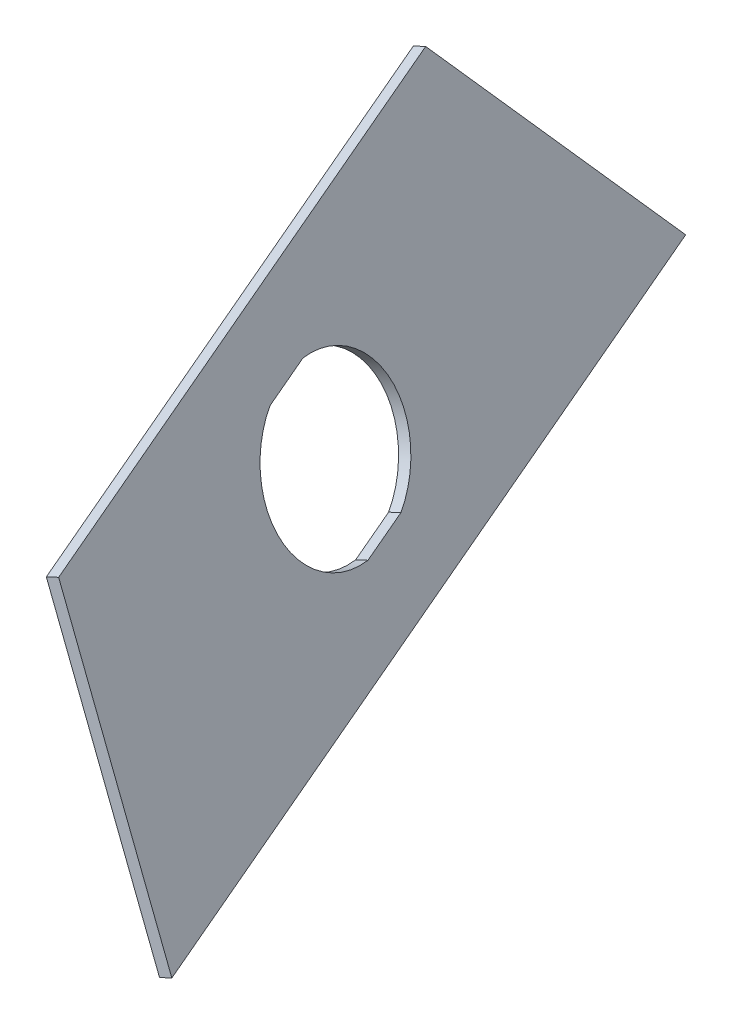
ISO-10303-21;
HEADER;
FILE_DESCRIPTION(('STEP AP214'),'2;1');
FILE_NAME('part.step','',(''),(''),'','','');
FILE_SCHEMA(('AUTOMOTIVE_DESIGN { 1 0 10303 214 1 1 1 1 }'));
ENDSEC;
DATA;
#1=APPLICATION_CONTEXT('core data for automotive mechanical design processes');
#2=APPLICATION_PROTOCOL_DEFINITION('international standard','automotive_design',2000,#1);
#3=PRODUCT_CONTEXT('',#1,'mechanical');
#4=PRODUCT('Part','Part','',(#3));
#5=PRODUCT_RELATED_PRODUCT_CATEGORY('part','',(#4));
#6=PRODUCT_DEFINITION_FORMATION('','',#4);
#7=PRODUCT_DEFINITION_CONTEXT('part definition',#1,'design');
#8=PRODUCT_DEFINITION('design','',#6,#7);
#9=PRODUCT_DEFINITION_SHAPE('','',#8);
#10=(LENGTH_UNIT() NAMED_UNIT(*) SI_UNIT(.MILLI.,.METRE.));
#11=(NAMED_UNIT(*) PLANE_ANGLE_UNIT() SI_UNIT($,.RADIAN.));
#12=(NAMED_UNIT(*) SI_UNIT($,.STERADIAN.) SOLID_ANGLE_UNIT());
#13=UNCERTAINTY_MEASURE_WITH_UNIT(LENGTH_MEASURE(1.E-05),#10,'distance_accuracy_value','');
#14=(GEOMETRIC_REPRESENTATION_CONTEXT(3) GLOBAL_UNCERTAINTY_ASSIGNED_CONTEXT((#13)) GLOBAL_UNIT_ASSIGNED_CONTEXT((#10,
#11,#12)) REPRESENTATION_CONTEXT('',''));
#15=CARTESIAN_POINT('',(0.,0.,0.));
#16=DIRECTION('',(0.,0.,1.));
#17=DIRECTION('',(1.,0.,0.));
#18=AXIS2_PLACEMENT_3D('',#15,#16,#17);
#19=CARTESIAN_POINT('',(458.420334770549,178.691758636198,-67.7030007615441));
#20=DIRECTION('',(0.923020405468225,0.359792371760229,-0.136318671914095));
#21=DIRECTION('',(0.363182667764731,-0.931717956162321,0.));
#22=AXIS2_PLACEMENT_3D('',#19,#20,#21);
#23=PLANE('',#22);
#24=DIRECTION('',(-0.243854446276022,0.273005986325031,-0.930592682360071));
#25=VECTOR('',#24,1.);
#26=CARTESIAN_POINT('',(128.763683655973,996.384967488977,-141.647653024973));
#27=LINE('',#26,#25);
#28=CARTESIAN_POINT('',(128.763683655973,996.384967488977,-141.647653024973));
#29=VERTEX_POINT('',#28);
#30=CARTESIAN_POINT('',(110.959125962403,1016.31796813114,-209.593066181555));
#31=VERTEX_POINT('',#30);
#32=EDGE_CURVE('E138',#29,#31,#27,.T.);
#33=ORIENTED_EDGE('',*,*,#32,.F.);
#34=DIRECTION('',(-0.363182667764734,0.93171795616232,0.));
#35=VECTOR('',#34,1.);
#36=CARTESIAN_POINT('',(144.228768588632,956.710449390366,-141.647653024972));
#37=LINE('',#36,#35);
#38=CARTESIAN_POINT('',(144.228768588632,956.710449390366,-141.647653024972));
#39=VERTEX_POINT('',#38);
#40=EDGE_CURVE('E148',#39,#29,#37,.T.);
#41=ORIENTED_EDGE('',*,*,#40,.F.);
#42=DIRECTION('',(0.243854446276023,-0.273005986325033,0.93059268236007));
#43=VECTOR('',#42,1.);
#44=CARTESIAN_POINT('',(119.302387817634,984.616650289393,-236.771231444188));
#45=LINE('',#44,#43);
#46=CARTESIAN_POINT('',(119.302387817634,984.616650289393,-236.771231444188));
#47=VERTEX_POINT('',#46);
#48=EDGE_CURVE('E145',#47,#39,#45,.T.);
#49=ORIENTED_EDGE('',*,*,#48,.F.);
#50=DIRECTION('',(0.195933492226962,-0.744475005184696,-0.638253110669266));
#51=VECTOR('',#50,1.);
#52=CARTESIAN_POINT('',(110.959125962403,1016.31796813114,-209.593066181555));
#53=LINE('',#52,#51);
#54=EDGE_CURVE('E141',#31,#47,#53,.T.);
#55=ORIENTED_EDGE('',*,*,#54,.F.);
#56=EDGE_LOOP('',(#33,#41,#49,#55));
#57=FACE_BOUND('',#56,.T.);
#58=DIRECTION('',(-0.24385444627601,0.273005986325048,-0.930592682360069));
#59=VECTOR('',#58,1.);
#60=CARTESIAN_POINT('',(121.889115720083,998.770697278187,-181.898918881072));
#61=LINE('',#60,#59);
#62=CARTESIAN_POINT('',(123.488176260416,996.980477306094,-175.79661457533));
#63=VERTEX_POINT('',#62);
#64=CARTESIAN_POINT('',(121.889115720083,998.770697278187,-181.898918881072));
#65=VERTEX_POINT('',#64);
#66=EDGE_CURVE('E119',#63,#65,#61,.T.);
#67=ORIENTED_EDGE('',*,*,#66,.T.);
#68=CARTESIAN_POINT('',(125.81349150616,988.507508824969,-182.414900918922));
#69=DIRECTION('',(-0.923020405468225,-0.359792371760229,0.136318671914095));
#70=DIRECTION('',(0.363182667764731,-0.931717956162321,0.));
#71=AXIS2_PLACEMENT_3D('',#68,#69,#70);
#72=CIRCLE('',#71,10.9999999999999);
#73=CARTESIAN_POINT('',(128.138806751904,980.034540343844,-189.033187262513));
#74=VERTEX_POINT('',#73);
#75=EDGE_CURVE('E124',#65,#74,#72,.T.);
#76=ORIENTED_EDGE('',*,*,#75,.T.);
#77=DIRECTION('',(0.243854446276026,-0.27300598632508,0.930592682360056));
#78=VECTOR('',#77,1.);
#79=CARTESIAN_POINT('',(129.737867292237,978.244320371751,-182.930882956771));
#80=LINE('',#79,#78);
#81=CARTESIAN_POINT('',(129.737867292237,978.244320371751,-182.930882956771));
#82=VERTEX_POINT('',#81);
#83=EDGE_CURVE('E120',#74,#82,#80,.T.);
#84=ORIENTED_EDGE('',*,*,#83,.T.);
#85=CARTESIAN_POINT('',(125.81349150616,988.507508824969,-182.414900918922));
#86=DIRECTION('',(-0.923020405468225,-0.359792371760229,0.136318671914095));
#87=DIRECTION('',(0.363182667764731,-0.931717956162321,0.));
#88=AXIS2_PLACEMENT_3D('',#85,#86,#87);
#89=CIRCLE('',#88,11.);
#90=EDGE_CURVE('E105',#82,#63,#89,.T.);
#91=ORIENTED_EDGE('',*,*,#90,.T.);
#92=EDGE_LOOP('',(#67,#76,#84,#91));
#93=FACE_BOUND('',#92,.T.);
#94=ADVANCED_FACE('F39',(#57,#93),#23,.T.);
#95=CARTESIAN_POINT('',(456.955039876868,178.120588246029,-67.4865948698805));
#96=DIRECTION('',(0.923020405468225,0.359792371760229,-0.136318671914095));
#97=DIRECTION('',(0.363182667764731,-0.931717956162321,0.));
#98=AXIS2_PLACEMENT_3D('',#95,#96,#97);
#99=PLANE('',#98);
#100=DIRECTION('',(-0.243854446276022,0.273005986325031,-0.930592682360071));
#101=VECTOR('',#100,1.);
#102=CARTESIAN_POINT('',(127.298388762292,995.813797098808,-141.431247133309));
#103=LINE('',#102,#101);
#104=CARTESIAN_POINT('',(127.298388762292,995.813797098808,-141.431247133309));
#105=VERTEX_POINT('',#104);
#106=CARTESIAN_POINT('',(109.493831068722,1015.74679774097,-209.376660289891));
#107=VERTEX_POINT('',#106);
#108=EDGE_CURVE('E113',#105,#107,#103,.T.);
#109=ORIENTED_EDGE('',*,*,#108,.T.);
#110=DIRECTION('',(0.195933492226962,-0.744475005184696,-0.638253110669266));
#111=VECTOR('',#110,1.);
#112=CARTESIAN_POINT('',(109.493831068722,1015.74679774097,-209.376660289891));
#113=LINE('',#112,#111);
#114=CARTESIAN_POINT('',(117.837092923953,984.045479899224,-236.554825552524));
#115=VERTEX_POINT('',#114);
#116=EDGE_CURVE('E154',#107,#115,#113,.T.);
#117=ORIENTED_EDGE('',*,*,#116,.T.);
#118=DIRECTION('',(0.243854446276023,-0.273005986325033,0.93059268236007));
#119=VECTOR('',#118,1.);
#120=CARTESIAN_POINT('',(117.837092923953,984.045479899224,-236.554825552524));
#121=LINE('',#120,#119);
#122=CARTESIAN_POINT('',(142.763473694951,956.139279000196,-141.431247133309));
#123=VERTEX_POINT('',#122);
#124=EDGE_CURVE('E157',#115,#123,#121,.T.);
#125=ORIENTED_EDGE('',*,*,#124,.T.);
#126=DIRECTION('',(-0.363182667764734,0.93171795616232,0.));
#127=VECTOR('',#126,1.);
#128=CARTESIAN_POINT('',(142.763473694951,956.139279000196,-141.431247133309));
#129=LINE('',#128,#127);
#130=EDGE_CURVE('E142',#123,#105,#129,.T.);
#131=ORIENTED_EDGE('',*,*,#130,.T.);
#132=EDGE_LOOP('',(#109,#117,#125,#131));
#133=FACE_BOUND('',#132,.T.);
#134=CARTESIAN_POINT('',(124.348196612479,987.936338434799,-182.198495027258));
#135=DIRECTION('',(-0.923020405468225,-0.359792371760229,0.136318671914095));
#136=DIRECTION('',(0.363182667764731,-0.931717956162321,0.));
#137=AXIS2_PLACEMENT_3D('',#134,#135,#136);
#138=CIRCLE('',#137,11.);
#139=CARTESIAN_POINT('',(128.272572398556,977.673149981581,-182.714477065108));
#140=VERTEX_POINT('',#139);
#141=CARTESIAN_POINT('',(122.022881366735,996.409306915925,-175.580208683667));
#142=VERTEX_POINT('',#141);
#143=EDGE_CURVE('E108',#140,#142,#138,.T.);
#144=ORIENTED_EDGE('',*,*,#143,.F.);
#145=DIRECTION('',(0.243854446276026,-0.27300598632508,0.930592682360056));
#146=VECTOR('',#145,1.);
#147=CARTESIAN_POINT('',(128.272572398556,977.673149981581,-182.714477065108));
#148=LINE('',#147,#146);
#149=CARTESIAN_POINT('',(126.673511858224,979.463369953674,-188.816781370849));
#150=VERTEX_POINT('',#149);
#151=EDGE_CURVE('E121',#150,#140,#148,.T.);
#152=ORIENTED_EDGE('',*,*,#151,.F.);
#153=CARTESIAN_POINT('',(124.348196612479,987.936338434799,-182.198495027258));
#154=DIRECTION('',(-0.923020405468225,-0.359792371760229,0.136318671914095));
#155=DIRECTION('',(0.363182667764731,-0.931717956162321,0.));
#156=AXIS2_PLACEMENT_3D('',#153,#154,#155);
#157=CIRCLE('',#156,10.9999999999999);
#158=CARTESIAN_POINT('',(120.423820826403,998.199526888018,-181.682512989408));
#159=VERTEX_POINT('',#158);
#160=EDGE_CURVE('E132',#159,#150,#157,.T.);
#161=ORIENTED_EDGE('',*,*,#160,.F.);
#162=DIRECTION('',(-0.24385444627601,0.273005986325048,-0.930592682360069));
#163=VECTOR('',#162,1.);
#164=CARTESIAN_POINT('',(120.423820826403,998.199526888018,-181.682512989408));
#165=LINE('',#164,#163);
#166=EDGE_CURVE('E130',#142,#159,#165,.T.);
#167=ORIENTED_EDGE('',*,*,#166,.F.);
#168=EDGE_LOOP('',(#144,#152,#161,#167));
#169=FACE_BOUND('',#168,.T.);
#170=ADVANCED_FACE('F174',(#133,#169),#99,.F.);
#171=CARTESIAN_POINT('',(128.763683655973,996.384967488977,-141.647653024973));
#172=DIRECTION('',(0.297604334848617,-0.89219794925445,-0.33972706578291));
#173=DIRECTION('',(0.,0.355850919999465,-0.934542734568909));
#174=AXIS2_PLACEMENT_3D('',#171,#172,#173);
#175=PLANE('',#174);
#176=ORIENTED_EDGE('',*,*,#108,.F.);
#177=DIRECTION('',(-0.923020405468225,-0.359792371760228,0.136318671914095));
#178=VECTOR('',#177,1.);
#179=CARTESIAN_POINT('',(128.763683655973,996.384967488977,-141.647653024973));
#180=LINE('',#179,#178);
#181=EDGE_CURVE('E151',#29,#105,#180,.T.);
#182=ORIENTED_EDGE('',*,*,#181,.F.);
#183=ORIENTED_EDGE('',*,*,#32,.T.);
#184=DIRECTION('',(-0.923020405468225,-0.359792371760228,0.136318671914095));
#185=VECTOR('',#184,1.);
#186=CARTESIAN_POINT('',(110.959125962403,1016.31796813114,-209.593066181555));
#187=LINE('',#186,#185);
#188=EDGE_CURVE('E11',#31,#107,#187,.T.);
#189=ORIENTED_EDGE('',*,*,#188,.T.);
#190=EDGE_LOOP('',(#176,#182,#183,#189));
#191=FACE_BOUND('',#190,.T.);
#192=ADVANCED_FACE('F41',(#191),#175,.F.);
#193=CARTESIAN_POINT('',(110.959125962403,1016.31796813114,-209.593066181555));
#194=DIRECTION('',(0.331124444451055,-0.562411251557432,0.75766099702214));
#195=DIRECTION('',(0.,-0.802958203384892,-0.596035337557184));
#196=AXIS2_PLACEMENT_3D('',#193,#194,#195);
#197=PLANE('',#196);
#198=ORIENTED_EDGE('',*,*,#116,.F.);
#199=ORIENTED_EDGE('',*,*,#188,.F.);
#200=ORIENTED_EDGE('',*,*,#54,.T.);
#201=DIRECTION('',(-0.923020405468225,-0.359792371760228,0.136318671914095));
#202=VECTOR('',#201,1.);
#203=CARTESIAN_POINT('',(119.302387817634,984.616650289393,-236.771231444188));
#204=LINE('',#203,#202);
#205=EDGE_CURVE('E47',#47,#115,#204,.T.);
#206=ORIENTED_EDGE('',*,*,#205,.T.);
#207=EDGE_LOOP('',(#198,#199,#200,#206));
#208=FACE_BOUND('',#207,.T.);
#209=ADVANCED_FACE('F167',(#208),#197,.F.);
#210=CARTESIAN_POINT('',(119.302387817634,984.616650289393,-236.771231444188));
#211=DIRECTION('',(-0.297604334848617,0.89219794925445,0.339727065782912));
#212=DIRECTION('',(0.,-0.355850919999467,0.934542734568908));
#213=AXIS2_PLACEMENT_3D('',#210,#211,#212);
#214=PLANE('',#213);
#215=ORIENTED_EDGE('',*,*,#124,.F.);
#216=ORIENTED_EDGE('',*,*,#205,.F.);
#217=ORIENTED_EDGE('',*,*,#48,.T.);
#218=DIRECTION('',(-0.923020405468225,-0.359792371760228,0.136318671914095));
#219=VECTOR('',#218,1.);
#220=CARTESIAN_POINT('',(144.228768588632,956.710449390366,-141.647653024972));
#221=LINE('',#220,#219);
#222=EDGE_CURVE('E163',#39,#123,#221,.T.);
#223=ORIENTED_EDGE('',*,*,#222,.T.);
#224=EDGE_LOOP('',(#215,#216,#217,#223));
#225=FACE_BOUND('',#224,.T.);
#226=ADVANCED_FACE('F171',(#225),#214,.F.);
#227=CARTESIAN_POINT('',(144.228768588632,956.710449390366,-141.647653024972));
#228=DIRECTION('',(-0.127010554382555,-0.0495085789319245,-0.990665039096251));
#229=DIRECTION('',(0.9918813848272,0.,-0.127166498863799));
#230=AXIS2_PLACEMENT_3D('',#227,#228,#229);
#231=PLANE('',#230);
#232=ORIENTED_EDGE('',*,*,#130,.F.);
#233=ORIENTED_EDGE('',*,*,#222,.F.);
#234=ORIENTED_EDGE('',*,*,#40,.T.);
#235=ORIENTED_EDGE('',*,*,#181,.T.);
#236=EDGE_LOOP('',(#232,#233,#234,#235));
#237=FACE_BOUND('',#236,.T.);
#238=ADVANCED_FACE('F182',(#237),#231,.F.);
#239=CARTESIAN_POINT('',(125.81349150616,988.507508824969,-182.414900918922));
#240=DIRECTION('',(-0.923020405468225,-0.359792371760228,0.136318671914095));
#241=DIRECTION('',(-0.363182667764731,0.931717956162321,0.));
#242=AXIS2_PLACEMENT_3D('',#239,#240,#241);
#243=CYLINDRICAL_SURFACE('',#242,11.);
#244=ORIENTED_EDGE('',*,*,#143,.T.);
#245=DIRECTION('',(-0.923020405468225,-0.359792371760228,0.136318671914095));
#246=VECTOR('',#245,1.);
#247=CARTESIAN_POINT('',(123.488176260416,996.980477306094,-175.79661457533));
#248=LINE('',#247,#246);
#249=EDGE_CURVE('E102',#63,#142,#248,.T.);
#250=ORIENTED_EDGE('',*,*,#249,.F.);
#251=ORIENTED_EDGE('',*,*,#90,.F.);
#252=DIRECTION('',(-0.923020405468225,-0.359792371760228,0.136318671914095));
#253=VECTOR('',#252,1.);
#254=CARTESIAN_POINT('',(129.737867292237,978.244320371751,-182.930882956771));
#255=LINE('',#254,#253);
#256=EDGE_CURVE('E62',#82,#140,#255,.T.);
#257=ORIENTED_EDGE('',*,*,#256,.T.);
#258=EDGE_LOOP('',(#244,#250,#251,#257));
#259=FACE_BOUND('',#258,.T.);
#260=ADVANCED_FACE('F104',(#259),#243,.F.);
#261=CARTESIAN_POINT('',(121.889115720083,998.770697278187,-181.898918881072));
#262=DIRECTION('',(0.297604334848614,-0.892197949254447,-0.339727065782921));
#263=DIRECTION('',(0.,0.355850919999477,-0.934542734568905));
#264=AXIS2_PLACEMENT_3D('',#261,#262,#263);
#265=PLANE('',#264);
#266=ORIENTED_EDGE('',*,*,#166,.T.);
#267=DIRECTION('',(-0.923020405468225,-0.359792371760228,0.136318671914095));
#268=VECTOR('',#267,1.);
#269=CARTESIAN_POINT('',(121.889115720083,998.770697278187,-181.898918881072));
#270=LINE('',#269,#268);
#271=EDGE_CURVE('E114',#65,#159,#270,.T.);
#272=ORIENTED_EDGE('',*,*,#271,.F.);
#273=ORIENTED_EDGE('',*,*,#66,.F.);
#274=ORIENTED_EDGE('',*,*,#249,.T.);
#275=EDGE_LOOP('',(#266,#272,#273,#274));
#276=FACE_BOUND('',#275,.T.);
#277=ADVANCED_FACE('F123',(#276),#265,.T.);
#278=CARTESIAN_POINT('',(125.81349150616,988.507508824969,-182.414900918922));
#279=DIRECTION('',(-0.923020405468225,-0.359792371760228,0.136318671914095));
#280=DIRECTION('',(-0.363182667764731,0.931717956162321,0.));
#281=AXIS2_PLACEMENT_3D('',#278,#279,#280);
#282=CYLINDRICAL_SURFACE('',#281,10.9999999999999);
#283=ORIENTED_EDGE('',*,*,#160,.T.);
#284=DIRECTION('',(-0.923020405468225,-0.359792371760228,0.136318671914095));
#285=VECTOR('',#284,1.);
#286=CARTESIAN_POINT('',(128.138806751904,980.034540343844,-189.033187262513));
#287=LINE('',#286,#285);
#288=EDGE_CURVE('E54',#74,#150,#287,.T.);
#289=ORIENTED_EDGE('',*,*,#288,.F.);
#290=ORIENTED_EDGE('',*,*,#75,.F.);
#291=ORIENTED_EDGE('',*,*,#271,.T.);
#292=EDGE_LOOP('',(#283,#289,#290,#291));
#293=FACE_BOUND('',#292,.T.);
#294=ADVANCED_FACE('F200',(#293),#282,.F.);
#295=CARTESIAN_POINT('',(129.737867292237,978.244320371751,-182.930882956771));
#296=DIRECTION('',(-0.297604334848605,0.892197949254437,0.339727065782957));
#297=DIRECTION('',(0.,-0.355850919999513,0.934542734568891));
#298=AXIS2_PLACEMENT_3D('',#295,#296,#297);
#299=PLANE('',#298);
#300=ORIENTED_EDGE('',*,*,#151,.T.);
#301=ORIENTED_EDGE('',*,*,#256,.F.);
#302=ORIENTED_EDGE('',*,*,#83,.F.);
#303=ORIENTED_EDGE('',*,*,#288,.T.);
#304=EDGE_LOOP('',(#300,#301,#302,#303));
#305=FACE_BOUND('',#304,.T.);
#306=ADVANCED_FACE('F203',(#305),#299,.T.);
#307=CLOSED_SHELL('',(#94,#170,#192,#209,#226,#238,#260,#277,#294,#306));
#308=MANIFOLD_SOLID_BREP('B2',#307);
#309=ADVANCED_BREP_SHAPE_REPRESENTATION('',(#18,#308),#14);
#310=SHAPE_DEFINITION_REPRESENTATION(#9,#309);
ENDSEC;
END-ISO-10303-21;
